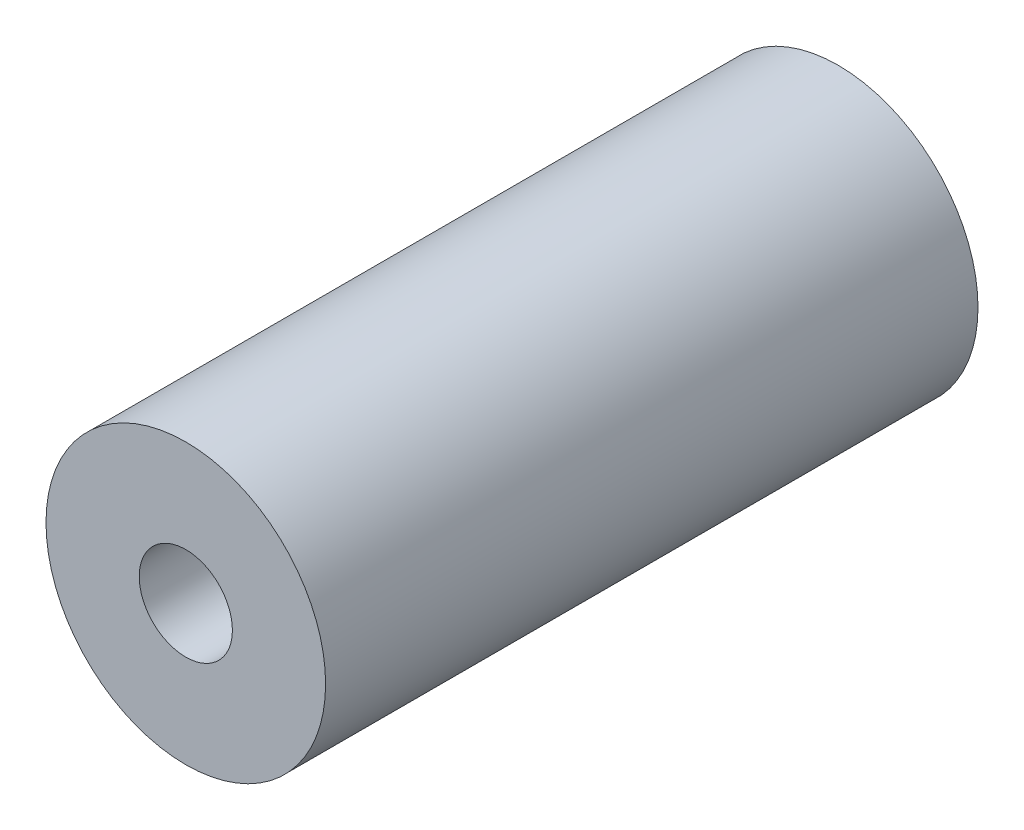
ISO-10303-21;
HEADER;
FILE_DESCRIPTION(('STEP AP214'),'2;1');
FILE_NAME('part.step','',(''),(''),'','','');
FILE_SCHEMA(('AUTOMOTIVE_DESIGN { 1 0 10303 214 1 1 1 1 }'));
ENDSEC;
DATA;
#1=APPLICATION_CONTEXT('core data for automotive mechanical design processes');
#2=APPLICATION_PROTOCOL_DEFINITION('international standard','automotive_design',2000,#1);
#3=PRODUCT_CONTEXT('',#1,'mechanical');
#4=PRODUCT('Part','Part','',(#3));
#5=PRODUCT_RELATED_PRODUCT_CATEGORY('part','',(#4));
#6=PRODUCT_DEFINITION_FORMATION('','',#4);
#7=PRODUCT_DEFINITION_CONTEXT('part definition',#1,'design');
#8=PRODUCT_DEFINITION('design','',#6,#7);
#9=PRODUCT_DEFINITION_SHAPE('','',#8);
#10=(LENGTH_UNIT() NAMED_UNIT(*) SI_UNIT(.MILLI.,.METRE.));
#11=(NAMED_UNIT(*) PLANE_ANGLE_UNIT() SI_UNIT($,.RADIAN.));
#12=(NAMED_UNIT(*) SI_UNIT($,.STERADIAN.) SOLID_ANGLE_UNIT());
#13=UNCERTAINTY_MEASURE_WITH_UNIT(LENGTH_MEASURE(1.E-05),#10,'distance_accuracy_value','');
#14=(GEOMETRIC_REPRESENTATION_CONTEXT(3) GLOBAL_UNCERTAINTY_ASSIGNED_CONTEXT((#13)) GLOBAL_UNIT_ASSIGNED_CONTEXT((#10,
#11,#12)) REPRESENTATION_CONTEXT('',''));
#15=CARTESIAN_POINT('',(0.,0.,0.));
#16=DIRECTION('',(0.,0.,1.));
#17=DIRECTION('',(1.,0.,0.));
#18=AXIS2_PLACEMENT_3D('',#15,#16,#17);
#19=CARTESIAN_POINT('',(0.,0.,14.));
#20=DIRECTION('',(0.,0.,-1.));
#21=DIRECTION('',(-1.,0.,0.));
#22=AXIS2_PLACEMENT_3D('',#19,#20,#21);
#23=CYLINDRICAL_SURFACE('',#22,3.);
#24=CARTESIAN_POINT('',(0.,0.,14.));
#25=DIRECTION('',(0.,0.,1.));
#26=DIRECTION('',(1.,0.,0.));
#27=AXIS2_PLACEMENT_3D('',#24,#25,#26);
#28=CIRCLE('',#27,3.);
#29=CARTESIAN_POINT('',(3.,0.,14.));
#30=VERTEX_POINT('',#29);
#31=EDGE_CURVE('E10',#30,#30,#28,.T.);
#32=ORIENTED_EDGE('',*,*,#31,.F.);
#33=EDGE_LOOP('',(#32));
#34=FACE_BOUND('',#33,.T.);
#35=CARTESIAN_POINT('',(0.,0.,0.));
#36=DIRECTION('',(0.,0.,1.));
#37=DIRECTION('',(1.,0.,0.));
#38=AXIS2_PLACEMENT_3D('',#35,#36,#37);
#39=CIRCLE('',#38,3.);
#40=CARTESIAN_POINT('',(3.,0.,0.));
#41=VERTEX_POINT('',#40);
#42=EDGE_CURVE('E45',#41,#41,#39,.T.);
#43=ORIENTED_EDGE('',*,*,#42,.T.);
#44=EDGE_LOOP('',(#43));
#45=FACE_BOUND('',#44,.T.);
#46=ADVANCED_FACE('F42',(#34,#45),#23,.T.);
#47=CARTESIAN_POINT('',(0.,0.,14.));
#48=DIRECTION('',(0.,0.,1.));
#49=DIRECTION('',(1.,0.,0.));
#50=AXIS2_PLACEMENT_3D('',#47,#48,#49);
#51=PLANE('',#50);
#52=CARTESIAN_POINT('',(0.,0.,14.));
#53=DIRECTION('',(0.,0.,1.));
#54=DIRECTION('',(1.,0.,0.));
#55=AXIS2_PLACEMENT_3D('',#52,#53,#54);
#56=CIRCLE('',#55,1.);
#57=CARTESIAN_POINT('',(1.,0.,14.));
#58=VERTEX_POINT('',#57);
#59=EDGE_CURVE('E59',#58,#58,#56,.T.);
#60=ORIENTED_EDGE('',*,*,#59,.F.);
#61=EDGE_LOOP('',(#60));
#62=FACE_BOUND('',#61,.T.);
#63=ORIENTED_EDGE('',*,*,#31,.T.);
#64=EDGE_LOOP('',(#63));
#65=FACE_BOUND('',#64,.T.);
#66=ADVANCED_FACE('F67',(#62,#65),#51,.T.);
#67=CARTESIAN_POINT('',(0.,0.,0.));
#68=DIRECTION('',(0.,0.,1.));
#69=DIRECTION('',(1.,0.,0.));
#70=AXIS2_PLACEMENT_3D('',#67,#68,#69);
#71=PLANE('',#70);
#72=CARTESIAN_POINT('',(0.,0.,0.));
#73=DIRECTION('',(0.,0.,1.));
#74=DIRECTION('',(1.,0.,0.));
#75=AXIS2_PLACEMENT_3D('',#72,#73,#74);
#76=CIRCLE('',#75,1.);
#77=CARTESIAN_POINT('',(1.,0.,0.));
#78=VERTEX_POINT('',#77);
#79=EDGE_CURVE('E54',#78,#78,#76,.F.);
#80=ORIENTED_EDGE('',*,*,#79,.F.);
#81=EDGE_LOOP('',(#80));
#82=FACE_BOUND('',#81,.T.);
#83=ORIENTED_EDGE('',*,*,#42,.F.);
#84=EDGE_LOOP('',(#83));
#85=FACE_BOUND('',#84,.T.);
#86=ADVANCED_FACE('F69',(#82,#85),#71,.F.);
#87=CARTESIAN_POINT('',(0.,0.,-0.000999999999999265));
#88=DIRECTION('',(0.,0.,1.));
#89=DIRECTION('',(1.,0.,0.));
#90=AXIS2_PLACEMENT_3D('',#87,#88,#89);
#91=CYLINDRICAL_SURFACE('',#90,1.);
#92=ORIENTED_EDGE('',*,*,#59,.T.);
#93=EDGE_LOOP('',(#92));
#94=FACE_BOUND('',#93,.T.);
#95=ORIENTED_EDGE('',*,*,#79,.T.);
#96=EDGE_LOOP('',(#95));
#97=FACE_BOUND('',#96,.T.);
#98=ADVANCED_FACE('F64',(#94,#97),#91,.F.);
#99=CLOSED_SHELL('',(#46,#66,#86,#98));
#100=MANIFOLD_SOLID_BREP('B2',#99);
#101=ADVANCED_BREP_SHAPE_REPRESENTATION('',(#18,#100),#14);
#102=SHAPE_DEFINITION_REPRESENTATION(#9,#101);
ENDSEC;
END-ISO-10303-21;
